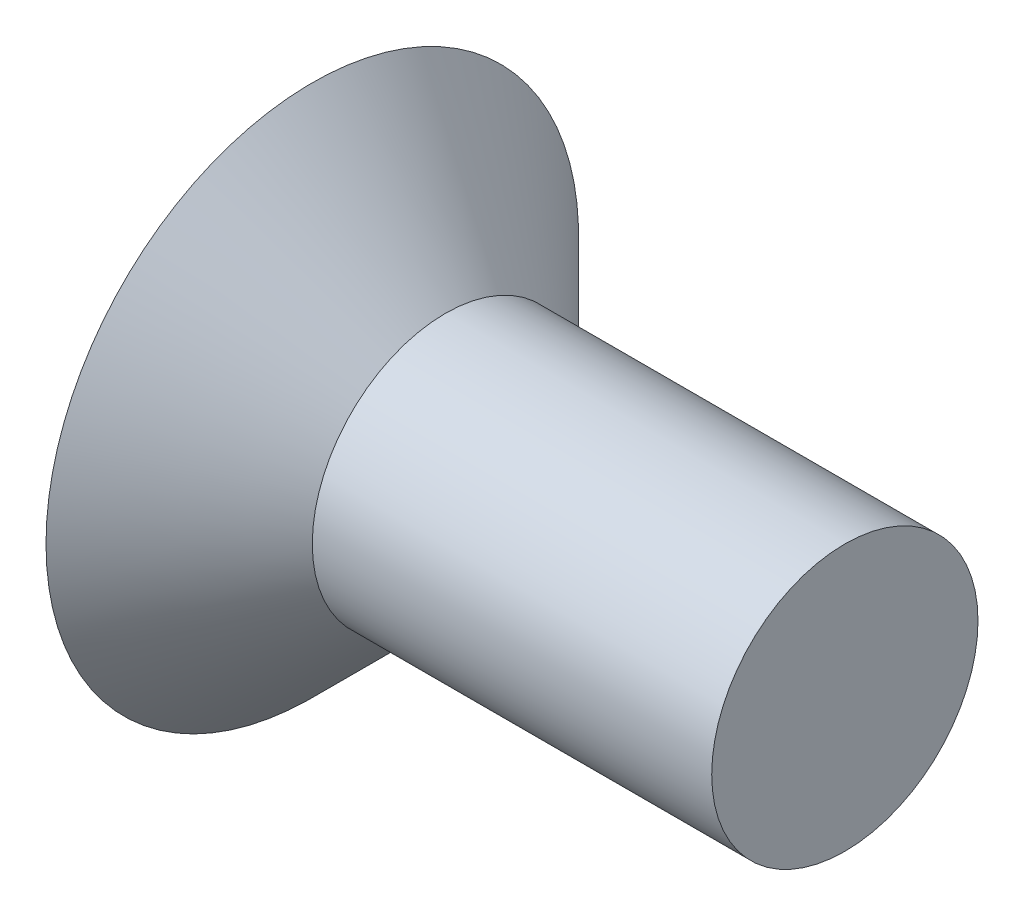
ISO-10303-21;
HEADER;
FILE_DESCRIPTION(('STEP AP214'),'2;1');
FILE_NAME('part.step','',(''),(''),'','','');
FILE_SCHEMA(('AUTOMOTIVE_DESIGN { 1 0 10303 214 1 1 1 1 }'));
ENDSEC;
DATA;
#1=APPLICATION_CONTEXT('core data for automotive mechanical design processes');
#2=APPLICATION_PROTOCOL_DEFINITION('international standard','automotive_design',2000,#1);
#3=PRODUCT_CONTEXT('',#1,'mechanical');
#4=PRODUCT('Part','Part','',(#3));
#5=PRODUCT_RELATED_PRODUCT_CATEGORY('part','',(#4));
#6=PRODUCT_DEFINITION_FORMATION('','',#4);
#7=PRODUCT_DEFINITION_CONTEXT('part definition',#1,'design');
#8=PRODUCT_DEFINITION('design','',#6,#7);
#9=PRODUCT_DEFINITION_SHAPE('','',#8);
#10=(LENGTH_UNIT() NAMED_UNIT(*) SI_UNIT(.MILLI.,.METRE.));
#11=(NAMED_UNIT(*) PLANE_ANGLE_UNIT() SI_UNIT($,.RADIAN.));
#12=(NAMED_UNIT(*) SI_UNIT($,.STERADIAN.) SOLID_ANGLE_UNIT());
#13=UNCERTAINTY_MEASURE_WITH_UNIT(LENGTH_MEASURE(1.E-05),#10,'distance_accuracy_value','');
#14=(GEOMETRIC_REPRESENTATION_CONTEXT(3) GLOBAL_UNCERTAINTY_ASSIGNED_CONTEXT((#13)) GLOBAL_UNIT_ASSIGNED_CONTEXT((#10,
#11,#12)) REPRESENTATION_CONTEXT('',''));
#15=CARTESIAN_POINT('',(0.,0.,0.));
#16=DIRECTION('',(0.,0.,1.));
#17=DIRECTION('',(1.,0.,0.));
#18=AXIS2_PLACEMENT_3D('',#15,#16,#17);
#19=CARTESIAN_POINT('',(0.,0.,0.));
#20=DIRECTION('',(-1.,0.,0.));
#21=DIRECTION('',(0.,0.,1.));
#22=AXIS2_PLACEMENT_3D('',#19,#20,#21);
#23=PLANE('',#22);
#24=DIRECTION('',(0.,0.5,-0.866025403784439));
#25=VECTOR('',#24,1.);
#26=CARTESIAN_POINT('',(0.,0.577350269189626,1.));
#27=LINE('',#26,#25);
#28=CARTESIAN_POINT('',(0.,0.577350269189626,1.));
#29=VERTEX_POINT('',#28);
#30=CARTESIAN_POINT('',(0.,1.15470053837925,0.));
#31=VERTEX_POINT('',#30);
#32=EDGE_CURVE('E54',#29,#31,#27,.T.);
#33=ORIENTED_EDGE('',*,*,#32,.F.);
#34=DIRECTION('',(0.,1.,0.));
#35=VECTOR('',#34,1.);
#36=CARTESIAN_POINT('',(0.,-0.577350269189626,1.));
#37=LINE('',#36,#35);
#38=CARTESIAN_POINT('',(0.,-0.577350269189626,1.));
#39=VERTEX_POINT('',#38);
#40=EDGE_CURVE('E137',#39,#29,#37,.T.);
#41=ORIENTED_EDGE('',*,*,#40,.F.);
#42=DIRECTION('',(0.,0.5,0.866025403784439));
#43=VECTOR('',#42,1.);
#44=CARTESIAN_POINT('',(0.,-1.15470053837925,0.));
#45=LINE('',#44,#43);
#46=CARTESIAN_POINT('',(0.,-1.15470053837925,0.));
#47=VERTEX_POINT('',#46);
#48=EDGE_CURVE('E135',#47,#39,#45,.T.);
#49=ORIENTED_EDGE('',*,*,#48,.F.);
#50=DIRECTION('',(0.,-0.5,0.866025403784439));
#51=VECTOR('',#50,1.);
#52=CARTESIAN_POINT('',(0.,-0.577350269189626,-1.));
#53=LINE('',#52,#51);
#54=CARTESIAN_POINT('',(0.,-0.577350269189626,-1.));
#55=VERTEX_POINT('',#54);
#56=EDGE_CURVE('E102',#55,#47,#53,.T.);
#57=ORIENTED_EDGE('',*,*,#56,.F.);
#58=DIRECTION('',(0.,-1.,0.));
#59=VECTOR('',#58,1.);
#60=CARTESIAN_POINT('',(0.,0.577350269189626,-1.));
#61=LINE('',#60,#59);
#62=CARTESIAN_POINT('',(0.,0.577350269189626,-1.));
#63=VERTEX_POINT('',#62);
#64=EDGE_CURVE('E131',#63,#55,#61,.T.);
#65=ORIENTED_EDGE('',*,*,#64,.F.);
#66=DIRECTION('',(0.,-0.5,-0.866025403784439));
#67=VECTOR('',#66,1.);
#68=CARTESIAN_POINT('',(0.,1.15470053837925,0.));
#69=LINE('',#68,#67);
#70=EDGE_CURVE('E128',#31,#63,#69,.T.);
#71=ORIENTED_EDGE('',*,*,#70,.F.);
#72=EDGE_LOOP('',(#33,#41,#49,#57,#65,#71));
#73=FACE_BOUND('',#72,.T.);
#74=CARTESIAN_POINT('',(0.,0.,0.));
#75=DIRECTION('',(-1.,0.,0.));
#76=DIRECTION('',(0.,0.,1.));
#77=AXIS2_PLACEMENT_3D('',#74,#75,#76);
#78=CIRCLE('',#77,3.);
#79=CARTESIAN_POINT('',(0.,0.,3.));
#80=VERTEX_POINT('',#79);
#81=EDGE_CURVE('E141',#80,#80,#78,.T.);
#82=ORIENTED_EDGE('',*,*,#81,.T.);
#83=EDGE_LOOP('',(#82));
#84=FACE_BOUND('',#83,.T.);
#85=ADVANCED_FACE('F40',(#73,#84),#23,.T.);
#86=CARTESIAN_POINT('',(6.,0.,0.));
#87=DIRECTION('',(-1.,0.,0.));
#88=DIRECTION('',(0.,0.,1.));
#89=AXIS2_PLACEMENT_3D('',#86,#87,#88);
#90=PLANE('',#89);
#91=CARTESIAN_POINT('',(6.,0.,0.));
#92=DIRECTION('',(-1.,0.,0.));
#93=DIRECTION('',(0.,0.,1.));
#94=AXIS2_PLACEMENT_3D('',#91,#92,#93);
#95=CIRCLE('',#94,1.5);
#96=CARTESIAN_POINT('',(6.,0.,1.5));
#97=VERTEX_POINT('',#96);
#98=EDGE_CURVE('E11',#97,#97,#95,.T.);
#99=ORIENTED_EDGE('',*,*,#98,.F.);
#100=EDGE_LOOP('',(#99));
#101=FACE_BOUND('',#100,.T.);
#102=ADVANCED_FACE('F156',(#101),#90,.F.);
#103=CARTESIAN_POINT('',(0.,0.,0.));
#104=DIRECTION('',(-1.,0.,0.));
#105=DIRECTION('',(0.,0.,1.));
#106=AXIS2_PLACEMENT_3D('',#103,#104,#105);
#107=CYLINDRICAL_SURFACE('',#106,1.5);
#108=CARTESIAN_POINT('',(1.50000000000001,0.,0.));
#109=DIRECTION('',(-1.,0.,0.));
#110=DIRECTION('',(0.,0.,1.));
#111=AXIS2_PLACEMENT_3D('',#108,#109,#110);
#112=CIRCLE('',#111,1.5);
#113=CARTESIAN_POINT('',(1.50000000000001,0.,1.5));
#114=VERTEX_POINT('',#113);
#115=EDGE_CURVE('E47',#114,#114,#112,.T.);
#116=ORIENTED_EDGE('',*,*,#115,.F.);
#117=EDGE_LOOP('',(#116));
#118=FACE_BOUND('',#117,.T.);
#119=ORIENTED_EDGE('',*,*,#98,.T.);
#120=EDGE_LOOP('',(#119));
#121=FACE_BOUND('',#120,.T.);
#122=ADVANCED_FACE('F153',(#118,#121),#107,.T.);
#123=CARTESIAN_POINT('',(1.50000000000001,0.,0.));
#124=DIRECTION('',(-1.,0.,0.));
#125=DIRECTION('',(0.,0.,1.));
#126=AXIS2_PLACEMENT_3D('',#123,#124,#125);
#127=CONICAL_SURFACE('',#126,1.5,0.785398163397446);
#128=ORIENTED_EDGE('',*,*,#81,.F.);
#129=EDGE_LOOP('',(#128));
#130=FACE_BOUND('',#129,.T.);
#131=ORIENTED_EDGE('',*,*,#115,.T.);
#132=EDGE_LOOP('',(#131));
#133=FACE_BOUND('',#132,.T.);
#134=ADVANCED_FACE('F151',(#130,#133),#127,.T.);
#135=CARTESIAN_POINT('',(1.,0.577350269189626,1.));
#136=DIRECTION('',(0.,0.866025403784439,0.5));
#137=DIRECTION('',(0.,-0.5,0.866025403784439));
#138=AXIS2_PLACEMENT_3D('',#135,#136,#137);
#139=PLANE('',#138);
#140=ORIENTED_EDGE('',*,*,#32,.T.);
#141=DIRECTION('',(-1.,0.,0.));
#142=VECTOR('',#141,1.);
#143=CARTESIAN_POINT('',(1.,1.15470053837925,0.));
#144=LINE('',#143,#142);
#145=CARTESIAN_POINT('',(1.,1.15470053837925,0.));
#146=VERTEX_POINT('',#145);
#147=EDGE_CURVE('E84',#146,#31,#144,.T.);
#148=ORIENTED_EDGE('',*,*,#147,.F.);
#149=DIRECTION('',(0.,0.5,-0.866025403784439));
#150=VECTOR('',#149,1.);
#151=CARTESIAN_POINT('',(1.,0.577350269189626,1.));
#152=LINE('',#151,#150);
#153=CARTESIAN_POINT('',(1.,0.577350269189626,1.));
#154=VERTEX_POINT('',#153);
#155=EDGE_CURVE('E139',#154,#146,#152,.T.);
#156=ORIENTED_EDGE('',*,*,#155,.F.);
#157=DIRECTION('',(-1.,0.,0.));
#158=VECTOR('',#157,1.);
#159=CARTESIAN_POINT('',(1.,0.577350269189626,1.));
#160=LINE('',#159,#158);
#161=EDGE_CURVE('E62',#154,#29,#160,.T.);
#162=ORIENTED_EDGE('',*,*,#161,.T.);
#163=EDGE_LOOP('',(#140,#148,#156,#162));
#164=FACE_BOUND('',#163,.T.);
#165=ADVANCED_FACE('F168',(#164),#139,.F.);
#166=CARTESIAN_POINT('',(1.,-0.577350269189626,1.));
#167=DIRECTION('',(0.,0.,1.));
#168=DIRECTION('',(1.,0.,0.));
#169=AXIS2_PLACEMENT_3D('',#166,#167,#168);
#170=PLANE('',#169);
#171=ORIENTED_EDGE('',*,*,#40,.T.);
#172=ORIENTED_EDGE('',*,*,#161,.F.);
#173=DIRECTION('',(0.,1.,0.));
#174=VECTOR('',#173,1.);
#175=CARTESIAN_POINT('',(1.,-0.577350269189626,1.));
#176=LINE('',#175,#174);
#177=CARTESIAN_POINT('',(1.,-0.577350269189626,1.));
#178=VERTEX_POINT('',#177);
#179=EDGE_CURVE('E114',#178,#154,#176,.T.);
#180=ORIENTED_EDGE('',*,*,#179,.F.);
#181=DIRECTION('',(-1.,0.,0.));
#182=VECTOR('',#181,1.);
#183=CARTESIAN_POINT('',(1.,-0.577350269189626,1.));
#184=LINE('',#183,#182);
#185=EDGE_CURVE('E106',#178,#39,#184,.T.);
#186=ORIENTED_EDGE('',*,*,#185,.T.);
#187=EDGE_LOOP('',(#171,#172,#180,#186));
#188=FACE_BOUND('',#187,.T.);
#189=ADVANCED_FACE('F172',(#188),#170,.F.);
#190=CARTESIAN_POINT('',(1.,-1.15470053837925,0.));
#191=DIRECTION('',(0.,-0.866025403784439,0.5));
#192=DIRECTION('',(0.,-0.5,-0.866025403784439));
#193=AXIS2_PLACEMENT_3D('',#190,#191,#192);
#194=PLANE('',#193);
#195=ORIENTED_EDGE('',*,*,#48,.T.);
#196=ORIENTED_EDGE('',*,*,#185,.F.);
#197=DIRECTION('',(0.,0.5,0.866025403784439));
#198=VECTOR('',#197,1.);
#199=CARTESIAN_POINT('',(1.,-1.15470053837925,0.));
#200=LINE('',#199,#198);
#201=CARTESIAN_POINT('',(1.,-1.15470053837925,0.));
#202=VERTEX_POINT('',#201);
#203=EDGE_CURVE('E110',#202,#178,#200,.T.);
#204=ORIENTED_EDGE('',*,*,#203,.F.);
#205=DIRECTION('',(-1.,0.,0.));
#206=VECTOR('',#205,1.);
#207=CARTESIAN_POINT('',(1.,-1.15470053837925,0.));
#208=LINE('',#207,#206);
#209=EDGE_CURVE('E95',#202,#47,#208,.T.);
#210=ORIENTED_EDGE('',*,*,#209,.T.);
#211=EDGE_LOOP('',(#195,#196,#204,#210));
#212=FACE_BOUND('',#211,.T.);
#213=ADVANCED_FACE('F111',(#212),#194,.F.);
#214=CARTESIAN_POINT('',(1.,-0.577350269189626,-1.));
#215=DIRECTION('',(0.,-0.866025403784439,-0.5));
#216=DIRECTION('',(0.,0.5,-0.866025403784439));
#217=AXIS2_PLACEMENT_3D('',#214,#215,#216);
#218=PLANE('',#217);
#219=ORIENTED_EDGE('',*,*,#56,.T.);
#220=ORIENTED_EDGE('',*,*,#209,.F.);
#221=DIRECTION('',(0.,-0.5,0.866025403784439));
#222=VECTOR('',#221,1.);
#223=CARTESIAN_POINT('',(1.,-0.577350269189626,-1.));
#224=LINE('',#223,#222);
#225=CARTESIAN_POINT('',(1.,-0.577350269189626,-1.));
#226=VERTEX_POINT('',#225);
#227=EDGE_CURVE('E99',#226,#202,#224,.T.);
#228=ORIENTED_EDGE('',*,*,#227,.F.);
#229=DIRECTION('',(-1.,0.,0.));
#230=VECTOR('',#229,1.);
#231=CARTESIAN_POINT('',(1.,-0.577350269189626,-1.));
#232=LINE('',#231,#230);
#233=EDGE_CURVE('E107',#226,#55,#232,.T.);
#234=ORIENTED_EDGE('',*,*,#233,.T.);
#235=EDGE_LOOP('',(#219,#220,#228,#234));
#236=FACE_BOUND('',#235,.T.);
#237=ADVANCED_FACE('F97',(#236),#218,.F.);
#238=CARTESIAN_POINT('',(1.,0.577350269189626,-1.));
#239=DIRECTION('',(0.,0.,-1.));
#240=DIRECTION('',(-1.,0.,0.));
#241=AXIS2_PLACEMENT_3D('',#238,#239,#240);
#242=PLANE('',#241);
#243=ORIENTED_EDGE('',*,*,#64,.T.);
#244=ORIENTED_EDGE('',*,*,#233,.F.);
#245=DIRECTION('',(0.,-1.,0.));
#246=VECTOR('',#245,1.);
#247=CARTESIAN_POINT('',(1.,0.577350269189626,-1.));
#248=LINE('',#247,#246);
#249=CARTESIAN_POINT('',(1.,0.577350269189626,-1.));
#250=VERTEX_POINT('',#249);
#251=EDGE_CURVE('E120',#250,#226,#248,.T.);
#252=ORIENTED_EDGE('',*,*,#251,.F.);
#253=DIRECTION('',(-1.,0.,0.));
#254=VECTOR('',#253,1.);
#255=CARTESIAN_POINT('',(1.,0.577350269189626,-1.));
#256=LINE('',#255,#254);
#257=EDGE_CURVE('E144',#250,#63,#256,.T.);
#258=ORIENTED_EDGE('',*,*,#257,.T.);
#259=EDGE_LOOP('',(#243,#244,#252,#258));
#260=FACE_BOUND('',#259,.T.);
#261=ADVANCED_FACE('F176',(#260),#242,.F.);
#262=CARTESIAN_POINT('',(1.,1.15470053837925,0.));
#263=DIRECTION('',(0.,0.866025403784439,-0.5));
#264=DIRECTION('',(0.,0.5,0.866025403784439));
#265=AXIS2_PLACEMENT_3D('',#262,#263,#264);
#266=PLANE('',#265);
#267=ORIENTED_EDGE('',*,*,#70,.T.);
#268=ORIENTED_EDGE('',*,*,#257,.F.);
#269=DIRECTION('',(0.,-0.5,-0.866025403784439));
#270=VECTOR('',#269,1.);
#271=CARTESIAN_POINT('',(1.,1.15470053837925,0.));
#272=LINE('',#271,#270);
#273=EDGE_CURVE('E122',#146,#250,#272,.T.);
#274=ORIENTED_EDGE('',*,*,#273,.F.);
#275=ORIENTED_EDGE('',*,*,#147,.T.);
#276=EDGE_LOOP('',(#267,#268,#274,#275));
#277=FACE_BOUND('',#276,.T.);
#278=ADVANCED_FACE('F173',(#277),#266,.F.);
#279=CARTESIAN_POINT('',(1.,0.,0.));
#280=DIRECTION('',(-1.,0.,0.));
#281=DIRECTION('',(0.,0.,1.));
#282=AXIS2_PLACEMENT_3D('',#279,#280,#281);
#283=PLANE('',#282);
#284=ORIENTED_EDGE('',*,*,#155,.T.);
#285=ORIENTED_EDGE('',*,*,#273,.T.);
#286=ORIENTED_EDGE('',*,*,#251,.T.);
#287=ORIENTED_EDGE('',*,*,#227,.T.);
#288=ORIENTED_EDGE('',*,*,#203,.T.);
#289=ORIENTED_EDGE('',*,*,#179,.T.);
#290=EDGE_LOOP('',(#284,#285,#286,#287,#288,#289));
#291=FACE_BOUND('',#290,.T.);
#292=ADVANCED_FACE('F117',(#291),#283,.T.);
#293=CLOSED_SHELL('',(#85,#102,#122,#134,#165,#189,#213,#237,#261,#278,#292));
#294=MANIFOLD_SOLID_BREP('B2',#293);
#295=ADVANCED_BREP_SHAPE_REPRESENTATION('',(#18,#294),#14);
#296=SHAPE_DEFINITION_REPRESENTATION(#9,#295);
ENDSEC;
END-ISO-10303-21;
